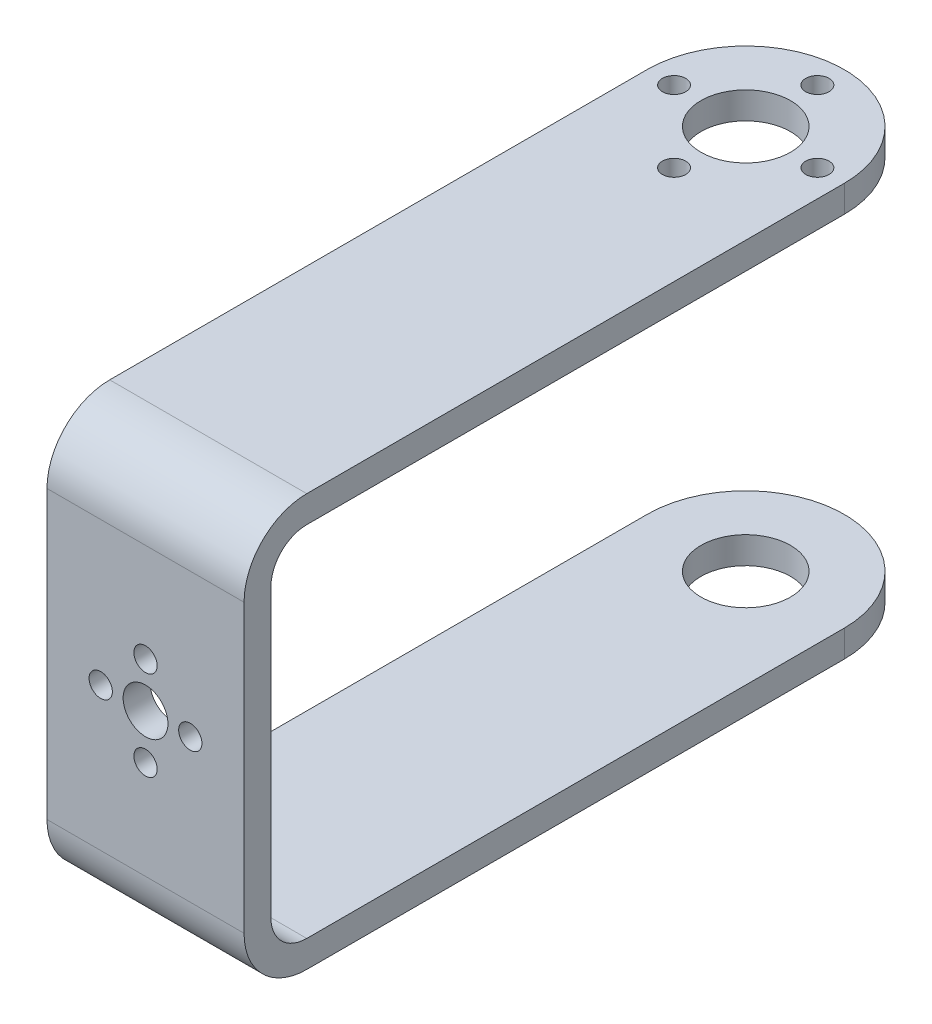
ISO-10303-21;
HEADER;
FILE_DESCRIPTION(('STEP AP214'),'2;1');
FILE_NAME('part.step','',(''),(''),'','','');
FILE_SCHEMA(('AUTOMOTIVE_DESIGN { 1 0 10303 214 1 1 1 1 }'));
ENDSEC;
DATA;
#1=APPLICATION_CONTEXT('core data for automotive mechanical design processes');
#2=APPLICATION_PROTOCOL_DEFINITION('international standard','automotive_design',2000,#1);
#3=PRODUCT_CONTEXT('',#1,'mechanical');
#4=PRODUCT('Part','Part','',(#3));
#5=PRODUCT_RELATED_PRODUCT_CATEGORY('part','',(#4));
#6=PRODUCT_DEFINITION_FORMATION('','',#4);
#7=PRODUCT_DEFINITION_CONTEXT('part definition',#1,'design');
#8=PRODUCT_DEFINITION('design','',#6,#7);
#9=PRODUCT_DEFINITION_SHAPE('','',#8);
#10=(LENGTH_UNIT() NAMED_UNIT(*) SI_UNIT(.MILLI.,.METRE.));
#11=(NAMED_UNIT(*) PLANE_ANGLE_UNIT() SI_UNIT($,.RADIAN.));
#12=(NAMED_UNIT(*) SI_UNIT($,.STERADIAN.) SOLID_ANGLE_UNIT());
#13=UNCERTAINTY_MEASURE_WITH_UNIT(LENGTH_MEASURE(1.E-05),#10,'distance_accuracy_value','');
#14=(GEOMETRIC_REPRESENTATION_CONTEXT(3) GLOBAL_UNCERTAINTY_ASSIGNED_CONTEXT((#13)) GLOBAL_UNIT_ASSIGNED_CONTEXT((#10,
#11,#12)) REPRESENTATION_CONTEXT('',''));
#15=CARTESIAN_POINT('',(0.,0.,0.));
#16=DIRECTION('',(0.,0.,1.));
#17=DIRECTION('',(1.,0.,0.));
#18=AXIS2_PLACEMENT_3D('',#15,#16,#17);
#19=CARTESIAN_POINT('',(-57.5295604965274,0.,67.));
#20=DIRECTION('',(0.,0.,1.));
#21=DIRECTION('',(0.,-1.,0.));
#22=AXIS2_PLACEMENT_3D('',#19,#20,#21);
#23=PLANE('',#22);
#24=CARTESIAN_POINT('',(5.00000000000001,-20.,67.));
#25=DIRECTION('',(0.,0.,1.));
#26=DIRECTION('',(1.,0.,0.));
#27=AXIS2_PLACEMENT_3D('',#24,#25,#26);
#28=CIRCLE('',#27,1.3);
#29=CARTESIAN_POINT('',(6.30000000000001,-20.,67.));
#30=VERTEX_POINT('',#29);
#31=EDGE_CURVE('E394',#30,#30,#28,.T.);
#32=ORIENTED_EDGE('',*,*,#31,.F.);
#33=EDGE_LOOP('',(#32));
#34=FACE_BOUND('',#33,.T.);
#35=CARTESIAN_POINT('',(0.,-25.,67.));
#36=DIRECTION('',(0.,0.,1.));
#37=DIRECTION('',(1.,0.,0.));
#38=AXIS2_PLACEMENT_3D('',#35,#36,#37);
#39=CIRCLE('',#38,1.3);
#40=CARTESIAN_POINT('',(1.30000000000001,-25.,67.));
#41=VERTEX_POINT('',#40);
#42=EDGE_CURVE('E386',#41,#41,#39,.T.);
#43=ORIENTED_EDGE('',*,*,#42,.F.);
#44=EDGE_LOOP('',(#43));
#45=FACE_BOUND('',#44,.T.);
#46=DIRECTION('',(0.,1.,0.));
#47=VECTOR('',#46,1.);
#48=CARTESIAN_POINT('',(-11.,0.,67.));
#49=LINE('',#48,#47);
#50=CARTESIAN_POINT('',(-11.,-36.,67.));
#51=VERTEX_POINT('',#50);
#52=CARTESIAN_POINT('',(-11.,-4.,67.));
#53=VERTEX_POINT('',#52);
#54=EDGE_CURVE('E175',#51,#53,#49,.T.);
#55=ORIENTED_EDGE('',*,*,#54,.F.);
#56=DIRECTION('',(1.,0.,0.));
#57=VECTOR('',#56,1.);
#58=CARTESIAN_POINT('',(-57.5295604965274,-36.,67.));
#59=LINE('',#58,#57);
#60=CARTESIAN_POINT('',(11.,-36.,67.));
#61=VERTEX_POINT('',#60);
#62=EDGE_CURVE('E210',#51,#61,#59,.T.);
#63=ORIENTED_EDGE('',*,*,#62,.T.);
#64=DIRECTION('',(0.,-1.,0.));
#65=VECTOR('',#64,1.);
#66=CARTESIAN_POINT('',(11.,0.,67.));
#67=LINE('',#66,#65);
#68=CARTESIAN_POINT('',(11.,-4.,67.));
#69=VERTEX_POINT('',#68);
#70=EDGE_CURVE('E195',#69,#61,#67,.T.);
#71=ORIENTED_EDGE('',*,*,#70,.F.);
#72=DIRECTION('',(1.,0.,0.));
#73=VECTOR('',#72,1.);
#74=CARTESIAN_POINT('',(-57.5295604965274,-4.,67.));
#75=LINE('',#74,#73);
#76=EDGE_CURVE('E212',#53,#69,#75,.T.);
#77=ORIENTED_EDGE('',*,*,#76,.F.);
#78=EDGE_LOOP('',(#55,#63,#71,#77));
#79=FACE_BOUND('',#78,.T.);
#80=CARTESIAN_POINT('',(0.,-20.,67.));
#81=DIRECTION('',(0.,0.,1.));
#82=DIRECTION('',(1.,0.,0.));
#83=AXIS2_PLACEMENT_3D('',#80,#81,#82);
#84=CIRCLE('',#83,2.5);
#85=CARTESIAN_POINT('',(2.50000000000001,-20.,67.));
#86=VERTEX_POINT('',#85);
#87=EDGE_CURVE('E401',#86,#86,#84,.T.);
#88=ORIENTED_EDGE('',*,*,#87,.F.);
#89=EDGE_LOOP('',(#88));
#90=FACE_BOUND('',#89,.T.);
#91=CARTESIAN_POINT('',(0.,-15.,67.));
#92=DIRECTION('',(0.,0.,1.));
#93=DIRECTION('',(1.,0.,0.));
#94=AXIS2_PLACEMENT_3D('',#91,#92,#93);
#95=CIRCLE('',#94,1.3);
#96=CARTESIAN_POINT('',(1.30000000000001,-15.,67.));
#97=VERTEX_POINT('',#96);
#98=EDGE_CURVE('E389',#97,#97,#95,.T.);
#99=ORIENTED_EDGE('',*,*,#98,.F.);
#100=EDGE_LOOP('',(#99));
#101=FACE_BOUND('',#100,.T.);
#102=CARTESIAN_POINT('',(-4.99999999999999,-20.,67.));
#103=DIRECTION('',(0.,0.,1.));
#104=DIRECTION('',(1.,0.,0.));
#105=AXIS2_PLACEMENT_3D('',#102,#103,#104);
#106=CIRCLE('',#105,1.3);
#107=CARTESIAN_POINT('',(-3.69999999999999,-20.,67.));
#108=VERTEX_POINT('',#107);
#109=EDGE_CURVE('E382',#108,#108,#106,.F.);
#110=ORIENTED_EDGE('',*,*,#109,.T.);
#111=EDGE_LOOP('',(#110));
#112=FACE_BOUND('',#111,.T.);
#113=ADVANCED_FACE('F34',(#34,#45,#79,#90,#101,#112),#23,.T.);
#114=CARTESIAN_POINT('',(-57.5295604965274,0.,64.));
#115=DIRECTION('',(0.,0.,1.));
#116=DIRECTION('',(1.,0.,0.));
#117=AXIS2_PLACEMENT_3D('',#114,#115,#116);
#118=PLANE('',#117);
#119=CARTESIAN_POINT('',(5.00000000000001,-20.,64.));
#120=DIRECTION('',(0.,0.,1.));
#121=DIRECTION('',(1.,0.,0.));
#122=AXIS2_PLACEMENT_3D('',#119,#120,#121);
#123=CIRCLE('',#122,1.3);
#124=CARTESIAN_POINT('',(6.30000000000001,-20.,64.));
#125=VERTEX_POINT('',#124);
#126=EDGE_CURVE('E397',#125,#125,#123,.F.);
#127=ORIENTED_EDGE('',*,*,#126,.F.);
#128=EDGE_LOOP('',(#127));
#129=FACE_BOUND('',#128,.T.);
#130=CARTESIAN_POINT('',(0.,-25.,64.));
#131=DIRECTION('',(0.,0.,1.));
#132=DIRECTION('',(1.,0.,0.));
#133=AXIS2_PLACEMENT_3D('',#130,#131,#132);
#134=CIRCLE('',#133,1.3);
#135=CARTESIAN_POINT('',(1.30000000000001,-25.,64.));
#136=VERTEX_POINT('',#135);
#137=EDGE_CURVE('E398',#136,#136,#134,.F.);
#138=ORIENTED_EDGE('',*,*,#137,.F.);
#139=EDGE_LOOP('',(#138));
#140=FACE_BOUND('',#139,.T.);
#141=CARTESIAN_POINT('',(0.,-15.,64.));
#142=DIRECTION('',(0.,0.,1.));
#143=DIRECTION('',(1.,0.,0.));
#144=AXIS2_PLACEMENT_3D('',#141,#142,#143);
#145=CIRCLE('',#144,1.3);
#146=CARTESIAN_POINT('',(1.30000000000001,-15.,64.));
#147=VERTEX_POINT('',#146);
#148=EDGE_CURVE('E384',#147,#147,#145,.F.);
#149=ORIENTED_EDGE('',*,*,#148,.F.);
#150=EDGE_LOOP('',(#149));
#151=FACE_BOUND('',#150,.T.);
#152=CARTESIAN_POINT('',(0.,-20.,64.));
#153=DIRECTION('',(0.,0.,1.));
#154=DIRECTION('',(1.,0.,0.));
#155=AXIS2_PLACEMENT_3D('',#152,#153,#154);
#156=CIRCLE('',#155,2.5);
#157=CARTESIAN_POINT('',(2.50000000000001,-20.,64.));
#158=VERTEX_POINT('',#157);
#159=EDGE_CURVE('E165',#158,#158,#156,.F.);
#160=ORIENTED_EDGE('',*,*,#159,.F.);
#161=EDGE_LOOP('',(#160));
#162=FACE_BOUND('',#161,.T.);
#163=DIRECTION('',(1.,0.,0.));
#164=VECTOR('',#163,1.);
#165=CARTESIAN_POINT('',(-57.5295604965274,-36.,64.));
#166=LINE('',#165,#164);
#167=CARTESIAN_POINT('',(-11.,-36.,64.));
#168=VERTEX_POINT('',#167);
#169=CARTESIAN_POINT('',(11.,-36.,64.));
#170=VERTEX_POINT('',#169);
#171=EDGE_CURVE('E204',#168,#170,#166,.T.);
#172=ORIENTED_EDGE('',*,*,#171,.F.);
#173=DIRECTION('',(0.,1.,0.));
#174=VECTOR('',#173,1.);
#175=CARTESIAN_POINT('',(-11.,0.,64.));
#176=LINE('',#175,#174);
#177=CARTESIAN_POINT('',(-11.,-4.,64.));
#178=VERTEX_POINT('',#177);
#179=EDGE_CURVE('E183',#168,#178,#176,.T.);
#180=ORIENTED_EDGE('',*,*,#179,.T.);
#181=DIRECTION('',(1.,0.,0.));
#182=VECTOR('',#181,1.);
#183=CARTESIAN_POINT('',(-57.5295604965274,-4.,64.));
#184=LINE('',#183,#182);
#185=CARTESIAN_POINT('',(11.,-4.,64.));
#186=VERTEX_POINT('',#185);
#187=EDGE_CURVE('E203',#178,#186,#184,.T.);
#188=ORIENTED_EDGE('',*,*,#187,.T.);
#189=DIRECTION('',(0.,-1.,0.));
#190=VECTOR('',#189,1.);
#191=CARTESIAN_POINT('',(11.,0.,64.));
#192=LINE('',#191,#190);
#193=EDGE_CURVE('E139',#186,#170,#192,.T.);
#194=ORIENTED_EDGE('',*,*,#193,.T.);
#195=EDGE_LOOP('',(#172,#180,#188,#194));
#196=FACE_BOUND('',#195,.T.);
#197=CARTESIAN_POINT('',(-4.99999999999999,-20.,64.));
#198=DIRECTION('',(0.,0.,1.));
#199=DIRECTION('',(1.,0.,0.));
#200=AXIS2_PLACEMENT_3D('',#197,#198,#199);
#201=CIRCLE('',#200,1.3);
#202=CARTESIAN_POINT('',(-3.69999999999999,-20.,64.));
#203=VERTEX_POINT('',#202);
#204=EDGE_CURVE('E379',#203,#203,#201,.T.);
#205=ORIENTED_EDGE('',*,*,#204,.T.);
#206=EDGE_LOOP('',(#205));
#207=FACE_BOUND('',#206,.T.);
#208=ADVANCED_FACE('F274',(#129,#140,#151,#162,#196,#207),#118,.F.);
#209=CARTESIAN_POINT('',(11.,3.,0.));
#210=DIRECTION('',(1.,0.,0.));
#211=DIRECTION('',(0.,0.,-1.));
#212=AXIS2_PLACEMENT_3D('',#209,#210,#211);
#213=PLANE('',#212);
#214=DIRECTION('',(0.,0.,1.));
#215=VECTOR('',#214,1.);
#216=CARTESIAN_POINT('',(11.,0.,0.));
#217=LINE('',#216,#215);
#218=CARTESIAN_POINT('',(11.,0.,0.));
#219=VERTEX_POINT('',#218);
#220=CARTESIAN_POINT('',(11.,0.,60.));
#221=VERTEX_POINT('',#220);
#222=EDGE_CURVE('E246',#219,#221,#217,.T.);
#223=ORIENTED_EDGE('',*,*,#222,.F.);
#224=DIRECTION('',(0.,-1.,0.));
#225=VECTOR('',#224,1.);
#226=CARTESIAN_POINT('',(11.,3.,0.));
#227=LINE('',#226,#225);
#228=CARTESIAN_POINT('',(11.,3.,0.));
#229=VERTEX_POINT('',#228);
#230=EDGE_CURVE('E11',#229,#219,#227,.T.);
#231=ORIENTED_EDGE('',*,*,#230,.F.);
#232=DIRECTION('',(0.,0.,1.));
#233=VECTOR('',#232,1.);
#234=CARTESIAN_POINT('',(11.,3.,0.));
#235=LINE('',#234,#233);
#236=CARTESIAN_POINT('',(11.,3.,60.));
#237=VERTEX_POINT('',#236);
#238=EDGE_CURVE('E224',#229,#237,#235,.T.);
#239=ORIENTED_EDGE('',*,*,#238,.T.);
#240=CARTESIAN_POINT('',(11.,-4.,60.));
#241=DIRECTION('',(1.,0.,0.));
#242=DIRECTION('',(0.,0.,-1.));
#243=AXIS2_PLACEMENT_3D('',#240,#241,#242);
#244=CIRCLE('',#243,7.);
#245=EDGE_CURVE('E192',#237,#69,#244,.T.);
#246=ORIENTED_EDGE('',*,*,#245,.T.);
#247=ORIENTED_EDGE('',*,*,#70,.T.);
#248=CARTESIAN_POINT('',(11.,-36.,60.));
#249=DIRECTION('',(1.,0.,0.));
#250=DIRECTION('',(0.,0.,-1.));
#251=AXIS2_PLACEMENT_3D('',#248,#249,#250);
#252=CIRCLE('',#251,7.00000000000002);
#253=CARTESIAN_POINT('',(11.,-43.,60.));
#254=VERTEX_POINT('',#253);
#255=EDGE_CURVE('E198',#61,#254,#252,.T.);
#256=ORIENTED_EDGE('',*,*,#255,.T.);
#257=DIRECTION('',(0.,0.,1.));
#258=VECTOR('',#257,1.);
#259=CARTESIAN_POINT('',(11.,-43.,0.));
#260=LINE('',#259,#258);
#261=CARTESIAN_POINT('',(11.,-43.,0.));
#262=VERTEX_POINT('',#261);
#263=EDGE_CURVE('E149',#262,#254,#260,.T.);
#264=ORIENTED_EDGE('',*,*,#263,.F.);
#265=DIRECTION('',(0.,1.,0.));
#266=VECTOR('',#265,1.);
#267=CARTESIAN_POINT('',(11.,-43.,0.));
#268=LINE('',#267,#266);
#269=CARTESIAN_POINT('',(11.,-40.,0.));
#270=VERTEX_POINT('',#269);
#271=EDGE_CURVE('E140',#262,#270,#268,.T.);
#272=ORIENTED_EDGE('',*,*,#271,.T.);
#273=DIRECTION('',(0.,0.,1.));
#274=VECTOR('',#273,1.);
#275=CARTESIAN_POINT('',(11.,-40.,0.));
#276=LINE('',#275,#274);
#277=CARTESIAN_POINT('',(11.,-40.,60.));
#278=VERTEX_POINT('',#277);
#279=EDGE_CURVE('E157',#270,#278,#276,.T.);
#280=ORIENTED_EDGE('',*,*,#279,.T.);
#281=CARTESIAN_POINT('',(11.,-36.,60.));
#282=DIRECTION('',(1.,0.,0.));
#283=DIRECTION('',(0.,0.,-1.));
#284=AXIS2_PLACEMENT_3D('',#281,#282,#283);
#285=CIRCLE('',#284,4.);
#286=EDGE_CURVE('E201',#170,#278,#285,.T.);
#287=ORIENTED_EDGE('',*,*,#286,.F.);
#288=ORIENTED_EDGE('',*,*,#193,.F.);
#289=CARTESIAN_POINT('',(11.,-4.,60.));
#290=DIRECTION('',(1.,0.,0.));
#291=DIRECTION('',(0.,0.,-1.));
#292=AXIS2_PLACEMENT_3D('',#289,#290,#291);
#293=CIRCLE('',#292,4.);
#294=EDGE_CURVE('E189',#221,#186,#293,.T.);
#295=ORIENTED_EDGE('',*,*,#294,.F.);
#296=EDGE_LOOP('',(#223,#231,#239,#246,#247,#256,#264,#272,#280,#287,#288,#295));
#297=FACE_BOUND('',#296,.T.);
#298=ADVANCED_FACE('F266',(#297),#213,.T.);
#299=CARTESIAN_POINT('',(0.,3.,0.));
#300=DIRECTION('',(0.,-1.,0.));
#301=DIRECTION('',(0.,0.,-1.));
#302=AXIS2_PLACEMENT_3D('',#299,#300,#301);
#303=CYLINDRICAL_SURFACE('',#302,11.);
#304=CARTESIAN_POINT('',(0.,0.,0.));
#305=DIRECTION('',(0.,1.,0.));
#306=DIRECTION('',(0.,0.,1.));
#307=AXIS2_PLACEMENT_3D('',#304,#305,#306);
#308=CIRCLE('',#307,11.);
#309=CARTESIAN_POINT('',(-11.,0.,0.));
#310=VERTEX_POINT('',#309);
#311=EDGE_CURVE('E248',#219,#310,#308,.T.);
#312=ORIENTED_EDGE('',*,*,#311,.T.);
#313=DIRECTION('',(0.,-1.,0.));
#314=VECTOR('',#313,1.);
#315=CARTESIAN_POINT('',(-11.,3.,0.));
#316=LINE('',#315,#314);
#317=CARTESIAN_POINT('',(-11.,3.,0.));
#318=VERTEX_POINT('',#317);
#319=EDGE_CURVE('E43',#318,#310,#316,.T.);
#320=ORIENTED_EDGE('',*,*,#319,.F.);
#321=CARTESIAN_POINT('',(0.,3.,0.));
#322=DIRECTION('',(0.,1.,0.));
#323=DIRECTION('',(0.,0.,1.));
#324=AXIS2_PLACEMENT_3D('',#321,#322,#323);
#325=CIRCLE('',#324,11.);
#326=EDGE_CURVE('E226',#229,#318,#325,.T.);
#327=ORIENTED_EDGE('',*,*,#326,.F.);
#328=ORIENTED_EDGE('',*,*,#230,.T.);
#329=EDGE_LOOP('',(#312,#320,#327,#328));
#330=FACE_BOUND('',#329,.T.);
#331=ADVANCED_FACE('F262',(#330),#303,.T.);
#332=CARTESIAN_POINT('',(-11.,3.,0.));
#333=DIRECTION('',(1.,0.,0.));
#334=DIRECTION('',(0.,0.,-1.));
#335=AXIS2_PLACEMENT_3D('',#332,#333,#334);
#336=PLANE('',#335);
#337=DIRECTION('',(0.,0.,1.));
#338=VECTOR('',#337,1.);
#339=CARTESIAN_POINT('',(-11.,0.,0.));
#340=LINE('',#339,#338);
#341=CARTESIAN_POINT('',(-11.,0.,60.));
#342=VERTEX_POINT('',#341);
#343=EDGE_CURVE('E65',#310,#342,#340,.T.);
#344=ORIENTED_EDGE('',*,*,#343,.T.);
#345=CARTESIAN_POINT('',(-11.,-4.,60.));
#346=DIRECTION('',(1.,0.,0.));
#347=DIRECTION('',(0.,0.,-1.));
#348=AXIS2_PLACEMENT_3D('',#345,#346,#347);
#349=CIRCLE('',#348,4.);
#350=EDGE_CURVE('E176',#178,#342,#349,.F.);
#351=ORIENTED_EDGE('',*,*,#350,.F.);
#352=ORIENTED_EDGE('',*,*,#179,.F.);
#353=CARTESIAN_POINT('',(-11.,-36.,60.));
#354=DIRECTION('',(1.,0.,0.));
#355=DIRECTION('',(0.,0.,-1.));
#356=AXIS2_PLACEMENT_3D('',#353,#354,#355);
#357=CIRCLE('',#356,4.);
#358=CARTESIAN_POINT('',(-11.,-40.,60.));
#359=VERTEX_POINT('',#358);
#360=EDGE_CURVE('E180',#359,#168,#357,.F.);
#361=ORIENTED_EDGE('',*,*,#360,.F.);
#362=DIRECTION('',(0.,0.,1.));
#363=VECTOR('',#362,1.);
#364=CARTESIAN_POINT('',(-11.,-40.,0.));
#365=LINE('',#364,#363);
#366=CARTESIAN_POINT('',(-11.,-40.,0.));
#367=VERTEX_POINT('',#366);
#368=EDGE_CURVE('E135',#367,#359,#365,.T.);
#369=ORIENTED_EDGE('',*,*,#368,.F.);
#370=DIRECTION('',(0.,1.,0.));
#371=VECTOR('',#370,1.);
#372=CARTESIAN_POINT('',(-11.,-43.,0.));
#373=LINE('',#372,#371);
#374=CARTESIAN_POINT('',(-11.,-43.,0.));
#375=VERTEX_POINT('',#374);
#376=EDGE_CURVE('E129',#375,#367,#373,.T.);
#377=ORIENTED_EDGE('',*,*,#376,.F.);
#378=DIRECTION('',(0.,0.,1.));
#379=VECTOR('',#378,1.);
#380=CARTESIAN_POINT('',(-11.,-43.,0.));
#381=LINE('',#380,#379);
#382=CARTESIAN_POINT('',(-11.,-43.,60.));
#383=VERTEX_POINT('',#382);
#384=EDGE_CURVE('E133',#375,#383,#381,.T.);
#385=ORIENTED_EDGE('',*,*,#384,.T.);
#386=CARTESIAN_POINT('',(-11.,-36.,60.));
#387=DIRECTION('',(1.,0.,0.));
#388=DIRECTION('',(0.,0.,-1.));
#389=AXIS2_PLACEMENT_3D('',#386,#387,#388);
#390=CIRCLE('',#389,7.00000000000002);
#391=EDGE_CURVE('E178',#383,#51,#390,.F.);
#392=ORIENTED_EDGE('',*,*,#391,.T.);
#393=ORIENTED_EDGE('',*,*,#54,.T.);
#394=CARTESIAN_POINT('',(-11.,-4.,60.));
#395=DIRECTION('',(1.,0.,0.));
#396=DIRECTION('',(0.,0.,-1.));
#397=AXIS2_PLACEMENT_3D('',#394,#395,#396);
#398=CIRCLE('',#397,7.);
#399=CARTESIAN_POINT('',(-11.,3.,60.));
#400=VERTEX_POINT('',#399);
#401=EDGE_CURVE('E172',#53,#400,#398,.F.);
#402=ORIENTED_EDGE('',*,*,#401,.T.);
#403=DIRECTION('',(0.,0.,1.));
#404=VECTOR('',#403,1.);
#405=CARTESIAN_POINT('',(-11.,3.,0.));
#406=LINE('',#405,#404);
#407=EDGE_CURVE('E229',#318,#400,#406,.T.);
#408=ORIENTED_EDGE('',*,*,#407,.F.);
#409=ORIENTED_EDGE('',*,*,#319,.T.);
#410=EDGE_LOOP('',(#344,#351,#352,#361,#369,#377,#385,#392,#393,#402,#408,#409));
#411=FACE_BOUND('',#410,.T.);
#412=ADVANCED_FACE('F131',(#411),#336,.F.);
#413=CARTESIAN_POINT('',(4.52787916007828E-13,3.,8.));
#414=DIRECTION('',(0.,-1.,0.));
#415=DIRECTION('',(0.,0.,-1.));
#416=AXIS2_PLACEMENT_3D('',#413,#414,#415);
#417=CYLINDRICAL_SURFACE('',#416,1.29999999999951);
#418=CARTESIAN_POINT('',(4.52787916007828E-13,3.,8.));
#419=DIRECTION('',(0.,1.,0.));
#420=DIRECTION('',(0.,0.,1.));
#421=AXIS2_PLACEMENT_3D('',#418,#419,#420);
#422=CIRCLE('',#421,1.29999999999951);
#423=CARTESIAN_POINT('',(4.52787916007828E-13,3.,9.29999999999951));
#424=VERTEX_POINT('',#423);
#425=EDGE_CURVE('E235',#424,#424,#422,.T.);
#426=ORIENTED_EDGE('',*,*,#425,.T.);
#427=EDGE_LOOP('',(#426));
#428=FACE_BOUND('',#427,.T.);
#429=CARTESIAN_POINT('',(4.52787916007828E-13,0.,8.));
#430=DIRECTION('',(0.,1.,0.));
#431=DIRECTION('',(0.,0.,1.));
#432=AXIS2_PLACEMENT_3D('',#429,#430,#431);
#433=CIRCLE('',#432,1.29999999999951);
#434=CARTESIAN_POINT('',(4.52787916007828E-13,0.,9.29999999999951));
#435=VERTEX_POINT('',#434);
#436=EDGE_CURVE('E256',#435,#435,#433,.T.);
#437=ORIENTED_EDGE('',*,*,#436,.F.);
#438=EDGE_LOOP('',(#437));
#439=FACE_BOUND('',#438,.T.);
#440=ADVANCED_FACE('F504',(#428,#439),#417,.F.);
#441=CARTESIAN_POINT('',(8.00000000000023,3.,-2.26393958003914E-13));
#442=DIRECTION('',(0.,-1.,0.));
#443=DIRECTION('',(0.,0.,-1.));
#444=AXIS2_PLACEMENT_3D('',#441,#442,#443);
#445=CYLINDRICAL_SURFACE('',#444,1.29999999999971);
#446=CARTESIAN_POINT('',(8.00000000000023,3.,-2.26393958003914E-13));
#447=DIRECTION('',(0.,1.,0.));
#448=DIRECTION('',(0.,0.,1.));
#449=AXIS2_PLACEMENT_3D('',#446,#447,#448);
#450=CIRCLE('',#449,1.29999999999971);
#451=CARTESIAN_POINT('',(8.00000000000023,3.,1.29999999999948));
#452=VERTEX_POINT('',#451);
#453=EDGE_CURVE('E232',#452,#452,#450,.T.);
#454=ORIENTED_EDGE('',*,*,#453,.T.);
#455=EDGE_LOOP('',(#454));
#456=FACE_BOUND('',#455,.T.);
#457=CARTESIAN_POINT('',(8.00000000000023,0.,-2.26393958003914E-13));
#458=DIRECTION('',(0.,1.,0.));
#459=DIRECTION('',(0.,0.,1.));
#460=AXIS2_PLACEMENT_3D('',#457,#458,#459);
#461=CIRCLE('',#460,1.29999999999971);
#462=CARTESIAN_POINT('',(8.00000000000023,0.,1.29999999999948));
#463=VERTEX_POINT('',#462);
#464=EDGE_CURVE('E253',#463,#463,#461,.T.);
#465=ORIENTED_EDGE('',*,*,#464,.F.);
#466=EDGE_LOOP('',(#465));
#467=FACE_BOUND('',#466,.T.);
#468=ADVANCED_FACE('F563',(#456,#467),#445,.F.);
#469=CARTESIAN_POINT('',(-7.99999999999977,3.,2.27373675443232E-13));
#470=DIRECTION('',(0.,-1.,0.));
#471=DIRECTION('',(0.,0.,-1.));
#472=AXIS2_PLACEMENT_3D('',#469,#470,#471);
#473=CYLINDRICAL_SURFACE('',#472,1.29999999999988);
#474=CARTESIAN_POINT('',(-7.99999999999977,3.,2.27373675443232E-13));
#475=DIRECTION('',(0.,1.,0.));
#476=DIRECTION('',(0.,0.,1.));
#477=AXIS2_PLACEMENT_3D('',#474,#475,#476);
#478=CIRCLE('',#477,1.29999999999988);
#479=CARTESIAN_POINT('',(-7.99999999999977,3.,1.3000000000001));
#480=VERTEX_POINT('',#479);
#481=EDGE_CURVE('E220',#480,#480,#478,.T.);
#482=ORIENTED_EDGE('',*,*,#481,.T.);
#483=EDGE_LOOP('',(#482));
#484=FACE_BOUND('',#483,.T.);
#485=CARTESIAN_POINT('',(-7.99999999999977,0.,2.27373675443232E-13));
#486=DIRECTION('',(0.,1.,0.));
#487=DIRECTION('',(0.,0.,1.));
#488=AXIS2_PLACEMENT_3D('',#485,#486,#487);
#489=CIRCLE('',#488,1.29999999999988);
#490=CARTESIAN_POINT('',(-7.99999999999977,0.,1.3000000000001));
#491=VERTEX_POINT('',#490);
#492=EDGE_CURVE('E243',#491,#491,#489,.T.);
#493=ORIENTED_EDGE('',*,*,#492,.F.);
#494=EDGE_LOOP('',(#493));
#495=FACE_BOUND('',#494,.T.);
#496=ADVANCED_FACE('F554',(#484,#495),#473,.F.);
#497=CARTESIAN_POINT('',(0.,3.,0.));
#498=DIRECTION('',(0.,-1.,0.));
#499=DIRECTION('',(0.,0.,-1.));
#500=AXIS2_PLACEMENT_3D('',#497,#498,#499);
#501=CYLINDRICAL_SURFACE('',#500,5.);
#502=CARTESIAN_POINT('',(0.,3.,0.));
#503=DIRECTION('',(0.,1.,0.));
#504=DIRECTION('',(0.,0.,1.));
#505=AXIS2_PLACEMENT_3D('',#502,#503,#504);
#506=CIRCLE('',#505,5.);
#507=CARTESIAN_POINT('',(0.,3.,5.));
#508=VERTEX_POINT('',#507);
#509=EDGE_CURVE('E217',#508,#508,#506,.T.);
#510=ORIENTED_EDGE('',*,*,#509,.T.);
#511=EDGE_LOOP('',(#510));
#512=FACE_BOUND('',#511,.T.);
#513=CARTESIAN_POINT('',(0.,0.,0.));
#514=DIRECTION('',(0.,1.,0.));
#515=DIRECTION('',(0.,0.,1.));
#516=AXIS2_PLACEMENT_3D('',#513,#514,#515);
#517=CIRCLE('',#516,5.);
#518=CARTESIAN_POINT('',(0.,0.,5.));
#519=VERTEX_POINT('',#518);
#520=EDGE_CURVE('E186',#519,#519,#517,.T.);
#521=ORIENTED_EDGE('',*,*,#520,.F.);
#522=EDGE_LOOP('',(#521));
#523=FACE_BOUND('',#522,.T.);
#524=ADVANCED_FACE('F36',(#512,#523),#501,.F.);
#525=CARTESIAN_POINT('',(0.,3.,-8.));
#526=DIRECTION('',(0.,-1.,0.));
#527=DIRECTION('',(0.,0.,-1.));
#528=AXIS2_PLACEMENT_3D('',#525,#526,#527);
#529=CYLINDRICAL_SURFACE('',#528,1.3);
#530=CARTESIAN_POINT('',(0.,3.,-8.));
#531=DIRECTION('',(0.,1.,0.));
#532=DIRECTION('',(0.,0.,1.));
#533=AXIS2_PLACEMENT_3D('',#530,#531,#532);
#534=CIRCLE('',#533,1.3);
#535=CARTESIAN_POINT('',(0.,3.,-6.7));
#536=VERTEX_POINT('',#535);
#537=EDGE_CURVE('E238',#536,#536,#534,.T.);
#538=ORIENTED_EDGE('',*,*,#537,.T.);
#539=EDGE_LOOP('',(#538));
#540=FACE_BOUND('',#539,.T.);
#541=CARTESIAN_POINT('',(0.,0.,-8.));
#542=DIRECTION('',(0.,1.,0.));
#543=DIRECTION('',(0.,0.,1.));
#544=AXIS2_PLACEMENT_3D('',#541,#542,#543);
#545=CIRCLE('',#544,1.3);
#546=CARTESIAN_POINT('',(0.,0.,-6.7));
#547=VERTEX_POINT('',#546);
#548=EDGE_CURVE('E221',#547,#547,#545,.T.);
#549=ORIENTED_EDGE('',*,*,#548,.F.);
#550=EDGE_LOOP('',(#549));
#551=FACE_BOUND('',#550,.T.);
#552=ADVANCED_FACE('F297',(#540,#551),#529,.F.);
#553=CARTESIAN_POINT('',(0.,3.,0.));
#554=DIRECTION('',(0.,1.,0.));
#555=DIRECTION('',(0.,0.,1.));
#556=AXIS2_PLACEMENT_3D('',#553,#554,#555);
#557=PLANE('',#556);
#558=ORIENTED_EDGE('',*,*,#509,.F.);
#559=EDGE_LOOP('',(#558));
#560=FACE_BOUND('',#559,.T.);
#561=ORIENTED_EDGE('',*,*,#481,.F.);
#562=EDGE_LOOP('',(#561));
#563=FACE_BOUND('',#562,.T.);
#564=ORIENTED_EDGE('',*,*,#238,.F.);
#565=ORIENTED_EDGE('',*,*,#326,.T.);
#566=ORIENTED_EDGE('',*,*,#407,.T.);
#567=DIRECTION('',(1.,0.,0.));
#568=VECTOR('',#567,1.);
#569=CARTESIAN_POINT('',(0.,3.,60.));
#570=LINE('',#569,#568);
#571=EDGE_CURVE('E51',#400,#237,#570,.T.);
#572=ORIENTED_EDGE('',*,*,#571,.T.);
#573=EDGE_LOOP('',(#564,#565,#566,#572));
#574=FACE_BOUND('',#573,.T.);
#575=ORIENTED_EDGE('',*,*,#453,.F.);
#576=EDGE_LOOP('',(#575));
#577=FACE_BOUND('',#576,.T.);
#578=ORIENTED_EDGE('',*,*,#425,.F.);
#579=EDGE_LOOP('',(#578));
#580=FACE_BOUND('',#579,.T.);
#581=ORIENTED_EDGE('',*,*,#537,.F.);
#582=EDGE_LOOP('',(#581));
#583=FACE_BOUND('',#582,.T.);
#584=ADVANCED_FACE('F294',(#560,#563,#574,#577,#580,#583),#557,.T.);
#585=CARTESIAN_POINT('',(0.,0.,0.));
#586=DIRECTION('',(0.,1.,0.));
#587=DIRECTION('',(0.,0.,1.));
#588=AXIS2_PLACEMENT_3D('',#585,#586,#587);
#589=PLANE('',#588);
#590=ORIENTED_EDGE('',*,*,#520,.T.);
#591=EDGE_LOOP('',(#590));
#592=FACE_BOUND('',#591,.T.);
#593=ORIENTED_EDGE('',*,*,#492,.T.);
#594=EDGE_LOOP('',(#593));
#595=FACE_BOUND('',#594,.T.);
#596=ORIENTED_EDGE('',*,*,#222,.T.);
#597=DIRECTION('',(1.,0.,0.));
#598=VECTOR('',#597,1.);
#599=CARTESIAN_POINT('',(0.,0.,60.));
#600=LINE('',#599,#598);
#601=EDGE_CURVE('E70',#342,#221,#600,.T.);
#602=ORIENTED_EDGE('',*,*,#601,.F.);
#603=ORIENTED_EDGE('',*,*,#343,.F.);
#604=ORIENTED_EDGE('',*,*,#311,.F.);
#605=EDGE_LOOP('',(#596,#602,#603,#604));
#606=FACE_BOUND('',#605,.T.);
#607=ORIENTED_EDGE('',*,*,#464,.T.);
#608=EDGE_LOOP('',(#607));
#609=FACE_BOUND('',#608,.T.);
#610=ORIENTED_EDGE('',*,*,#436,.T.);
#611=EDGE_LOOP('',(#610));
#612=FACE_BOUND('',#611,.T.);
#613=ORIENTED_EDGE('',*,*,#548,.T.);
#614=EDGE_LOOP('',(#613));
#615=FACE_BOUND('',#614,.T.);
#616=ADVANCED_FACE('F263',(#592,#595,#606,#609,#612,#615),#589,.F.);
#617=CARTESIAN_POINT('',(-57.5295604965274,-4.,60.));
#618=DIRECTION('',(1.,0.,0.));
#619=DIRECTION('',(0.,0.,-1.));
#620=AXIS2_PLACEMENT_3D('',#617,#618,#619);
#621=CYLINDRICAL_SURFACE('',#620,4.);
#622=ORIENTED_EDGE('',*,*,#187,.F.);
#623=ORIENTED_EDGE('',*,*,#350,.T.);
#624=ORIENTED_EDGE('',*,*,#601,.T.);
#625=ORIENTED_EDGE('',*,*,#294,.T.);
#626=EDGE_LOOP('',(#622,#623,#624,#625));
#627=FACE_BOUND('',#626,.T.);
#628=ADVANCED_FACE('F271',(#627),#621,.F.);
#629=CARTESIAN_POINT('',(-57.5295604965274,-4.,60.));
#630=DIRECTION('',(1.,0.,0.));
#631=DIRECTION('',(0.,0.,-1.));
#632=AXIS2_PLACEMENT_3D('',#629,#630,#631);
#633=CYLINDRICAL_SURFACE('',#632,7.);
#634=ORIENTED_EDGE('',*,*,#401,.F.);
#635=ORIENTED_EDGE('',*,*,#76,.T.);
#636=ORIENTED_EDGE('',*,*,#245,.F.);
#637=ORIENTED_EDGE('',*,*,#571,.F.);
#638=EDGE_LOOP('',(#634,#635,#636,#637));
#639=FACE_BOUND('',#638,.T.);
#640=ADVANCED_FACE('F293',(#639),#633,.T.);
#641=CARTESIAN_POINT('',(-57.5295604965274,-36.,60.));
#642=DIRECTION('',(1.,0.,0.));
#643=DIRECTION('',(0.,0.,-1.));
#644=AXIS2_PLACEMENT_3D('',#641,#642,#643);
#645=CYLINDRICAL_SURFACE('',#644,7.00000000000002);
#646=ORIENTED_EDGE('',*,*,#391,.F.);
#647=DIRECTION('',(1.,0.,0.));
#648=VECTOR('',#647,1.);
#649=CARTESIAN_POINT('',(-57.5295604965274,-43.,60.));
#650=LINE('',#649,#648);
#651=EDGE_CURVE('E153',#383,#254,#650,.T.);
#652=ORIENTED_EDGE('',*,*,#651,.T.);
#653=ORIENTED_EDGE('',*,*,#255,.F.);
#654=ORIENTED_EDGE('',*,*,#62,.F.);
#655=EDGE_LOOP('',(#646,#652,#653,#654));
#656=FACE_BOUND('',#655,.T.);
#657=ADVANCED_FACE('F285',(#656),#645,.T.);
#658=CARTESIAN_POINT('',(-57.5295604965274,-36.,60.));
#659=DIRECTION('',(1.,0.,0.));
#660=DIRECTION('',(0.,0.,-1.));
#661=AXIS2_PLACEMENT_3D('',#658,#659,#660);
#662=CYLINDRICAL_SURFACE('',#661,4.);
#663=DIRECTION('',(1.,0.,0.));
#664=VECTOR('',#663,1.);
#665=CARTESIAN_POINT('',(-57.5295604965274,-40.,60.));
#666=LINE('',#665,#664);
#667=EDGE_CURVE('E206',#359,#278,#666,.T.);
#668=ORIENTED_EDGE('',*,*,#667,.F.);
#669=ORIENTED_EDGE('',*,*,#360,.T.);
#670=ORIENTED_EDGE('',*,*,#171,.T.);
#671=ORIENTED_EDGE('',*,*,#286,.T.);
#672=EDGE_LOOP('',(#668,#669,#670,#671));
#673=FACE_BOUND('',#672,.T.);
#674=ADVANCED_FACE('F278',(#673),#662,.F.);
#675=CARTESIAN_POINT('',(0.,-43.,0.));
#676=DIRECTION('',(0.,1.,0.));
#677=DIRECTION('',(0.,0.,1.));
#678=AXIS2_PLACEMENT_3D('',#675,#676,#677);
#679=CYLINDRICAL_SURFACE('',#678,11.);
#680=CARTESIAN_POINT('',(0.,-40.,0.));
#681=DIRECTION('',(0.,-1.,0.));
#682=DIRECTION('',(0.,0.,-1.));
#683=AXIS2_PLACEMENT_3D('',#680,#681,#682);
#684=CIRCLE('',#683,11.);
#685=EDGE_CURVE('E167',#367,#270,#684,.T.);
#686=ORIENTED_EDGE('',*,*,#685,.T.);
#687=ORIENTED_EDGE('',*,*,#271,.F.);
#688=CARTESIAN_POINT('',(0.,-43.,0.));
#689=DIRECTION('',(0.,-1.,0.));
#690=DIRECTION('',(0.,0.,-1.));
#691=AXIS2_PLACEMENT_3D('',#688,#689,#690);
#692=CIRCLE('',#691,11.);
#693=EDGE_CURVE('E144',#375,#262,#692,.T.);
#694=ORIENTED_EDGE('',*,*,#693,.F.);
#695=ORIENTED_EDGE('',*,*,#376,.T.);
#696=EDGE_LOOP('',(#686,#687,#694,#695));
#697=FACE_BOUND('',#696,.T.);
#698=ADVANCED_FACE('F145',(#697),#679,.T.);
#699=CARTESIAN_POINT('',(0.,-43.,0.));
#700=DIRECTION('',(0.,1.,0.));
#701=DIRECTION('',(0.,0.,1.));
#702=AXIS2_PLACEMENT_3D('',#699,#700,#701);
#703=CYLINDRICAL_SURFACE('',#702,5.);
#704=CARTESIAN_POINT('',(0.,-43.,0.));
#705=DIRECTION('',(0.,-1.,0.));
#706=DIRECTION('',(0.,0.,-1.));
#707=AXIS2_PLACEMENT_3D('',#704,#705,#706);
#708=CIRCLE('',#707,5.);
#709=CARTESIAN_POINT('',(0.,-43.,-5.));
#710=VERTEX_POINT('',#709);
#711=EDGE_CURVE('E154',#710,#710,#708,.T.);
#712=ORIENTED_EDGE('',*,*,#711,.T.);
#713=EDGE_LOOP('',(#712));
#714=FACE_BOUND('',#713,.T.);
#715=CARTESIAN_POINT('',(0.,-40.,0.));
#716=DIRECTION('',(0.,-1.,0.));
#717=DIRECTION('',(0.,0.,-1.));
#718=AXIS2_PLACEMENT_3D('',#715,#716,#717);
#719=CIRCLE('',#718,5.);
#720=CARTESIAN_POINT('',(0.,-40.,-5.));
#721=VERTEX_POINT('',#720);
#722=EDGE_CURVE('E162',#721,#721,#719,.T.);
#723=ORIENTED_EDGE('',*,*,#722,.F.);
#724=EDGE_LOOP('',(#723));
#725=FACE_BOUND('',#724,.T.);
#726=ADVANCED_FACE('F343',(#714,#725),#703,.F.);
#727=CARTESIAN_POINT('',(0.,-43.,0.));
#728=DIRECTION('',(0.,-1.,0.));
#729=DIRECTION('',(0.,0.,-1.));
#730=AXIS2_PLACEMENT_3D('',#727,#728,#729);
#731=PLANE('',#730);
#732=ORIENTED_EDGE('',*,*,#711,.F.);
#733=EDGE_LOOP('',(#732));
#734=FACE_BOUND('',#733,.T.);
#735=ORIENTED_EDGE('',*,*,#384,.F.);
#736=ORIENTED_EDGE('',*,*,#693,.T.);
#737=ORIENTED_EDGE('',*,*,#263,.T.);
#738=ORIENTED_EDGE('',*,*,#651,.F.);
#739=EDGE_LOOP('',(#735,#736,#737,#738));
#740=FACE_BOUND('',#739,.T.);
#741=ADVANCED_FACE('F152',(#734,#740),#731,.T.);
#742=CARTESIAN_POINT('',(0.,-40.,0.));
#743=DIRECTION('',(0.,-1.,0.));
#744=DIRECTION('',(0.,0.,-1.));
#745=AXIS2_PLACEMENT_3D('',#742,#743,#744);
#746=PLANE('',#745);
#747=ORIENTED_EDGE('',*,*,#722,.T.);
#748=EDGE_LOOP('',(#747));
#749=FACE_BOUND('',#748,.T.);
#750=ORIENTED_EDGE('',*,*,#368,.T.);
#751=ORIENTED_EDGE('',*,*,#667,.T.);
#752=ORIENTED_EDGE('',*,*,#279,.F.);
#753=ORIENTED_EDGE('',*,*,#685,.F.);
#754=EDGE_LOOP('',(#750,#751,#752,#753));
#755=FACE_BOUND('',#754,.T.);
#756=ADVANCED_FACE('F280',(#749,#755),#746,.F.);
#757=CARTESIAN_POINT('',(0.,-20.,56.9289321881345));
#758=DIRECTION('',(0.,0.,1.));
#759=DIRECTION('',(1.,0.,0.));
#760=AXIS2_PLACEMENT_3D('',#757,#758,#759);
#761=CYLINDRICAL_SURFACE('',#760,2.5);
#762=ORIENTED_EDGE('',*,*,#159,.T.);
#763=EDGE_LOOP('',(#762));
#764=FACE_BOUND('',#763,.T.);
#765=ORIENTED_EDGE('',*,*,#87,.T.);
#766=EDGE_LOOP('',(#765));
#767=FACE_BOUND('',#766,.T.);
#768=ADVANCED_FACE('F351',(#764,#767),#761,.F.);
#769=CARTESIAN_POINT('',(0.,-15.,56.9289321881345));
#770=DIRECTION('',(0.,0.,1.));
#771=DIRECTION('',(1.,0.,0.));
#772=AXIS2_PLACEMENT_3D('',#769,#770,#771);
#773=CYLINDRICAL_SURFACE('',#772,1.3);
#774=ORIENTED_EDGE('',*,*,#148,.T.);
#775=EDGE_LOOP('',(#774));
#776=FACE_BOUND('',#775,.T.);
#777=ORIENTED_EDGE('',*,*,#98,.T.);
#778=EDGE_LOOP('',(#777));
#779=FACE_BOUND('',#778,.T.);
#780=ADVANCED_FACE('F358',(#776,#779),#773,.F.);
#781=CARTESIAN_POINT('',(-4.99999999999999,-20.,56.9289321881345));
#782=DIRECTION('',(0.,0.,1.));
#783=DIRECTION('',(1.,0.,0.));
#784=AXIS2_PLACEMENT_3D('',#781,#782,#783);
#785=CYLINDRICAL_SURFACE('',#784,1.3);
#786=ORIENTED_EDGE('',*,*,#204,.F.);
#787=EDGE_LOOP('',(#786));
#788=FACE_BOUND('',#787,.T.);
#789=ORIENTED_EDGE('',*,*,#109,.F.);
#790=EDGE_LOOP('',(#789));
#791=FACE_BOUND('',#790,.T.);
#792=ADVANCED_FACE('F364',(#788,#791),#785,.F.);
#793=CARTESIAN_POINT('',(0.,-25.,56.9289321881345));
#794=DIRECTION('',(0.,0.,1.));
#795=DIRECTION('',(1.,0.,0.));
#796=AXIS2_PLACEMENT_3D('',#793,#794,#795);
#797=CYLINDRICAL_SURFACE('',#796,1.3);
#798=ORIENTED_EDGE('',*,*,#137,.T.);
#799=EDGE_LOOP('',(#798));
#800=FACE_BOUND('',#799,.T.);
#801=ORIENTED_EDGE('',*,*,#42,.T.);
#802=EDGE_LOOP('',(#801));
#803=FACE_BOUND('',#802,.T.);
#804=ADVANCED_FACE('F360',(#800,#803),#797,.F.);
#805=CARTESIAN_POINT('',(5.00000000000001,-20.,56.9289321881345));
#806=DIRECTION('',(0.,0.,1.));
#807=DIRECTION('',(1.,0.,0.));
#808=AXIS2_PLACEMENT_3D('',#805,#806,#807);
#809=CYLINDRICAL_SURFACE('',#808,1.3);
#810=ORIENTED_EDGE('',*,*,#126,.T.);
#811=EDGE_LOOP('',(#810));
#812=FACE_BOUND('',#811,.T.);
#813=ORIENTED_EDGE('',*,*,#31,.T.);
#814=EDGE_LOOP('',(#813));
#815=FACE_BOUND('',#814,.T.);
#816=ADVANCED_FACE('F363',(#812,#815),#809,.F.);
#817=CLOSED_SHELL('',(#113,#208,#298,#331,#412,#440,#468,#496,#524,#552,#584,#616,#628,#640,
#657,#674,#698,#726,#741,#756,#768,#780,#792,#804,#816));
#818=MANIFOLD_SOLID_BREP('B2',#817);
#819=ADVANCED_BREP_SHAPE_REPRESENTATION('',(#18,#818),#14);
#820=SHAPE_DEFINITION_REPRESENTATION(#9,#819);
ENDSEC;
END-ISO-10303-21;
